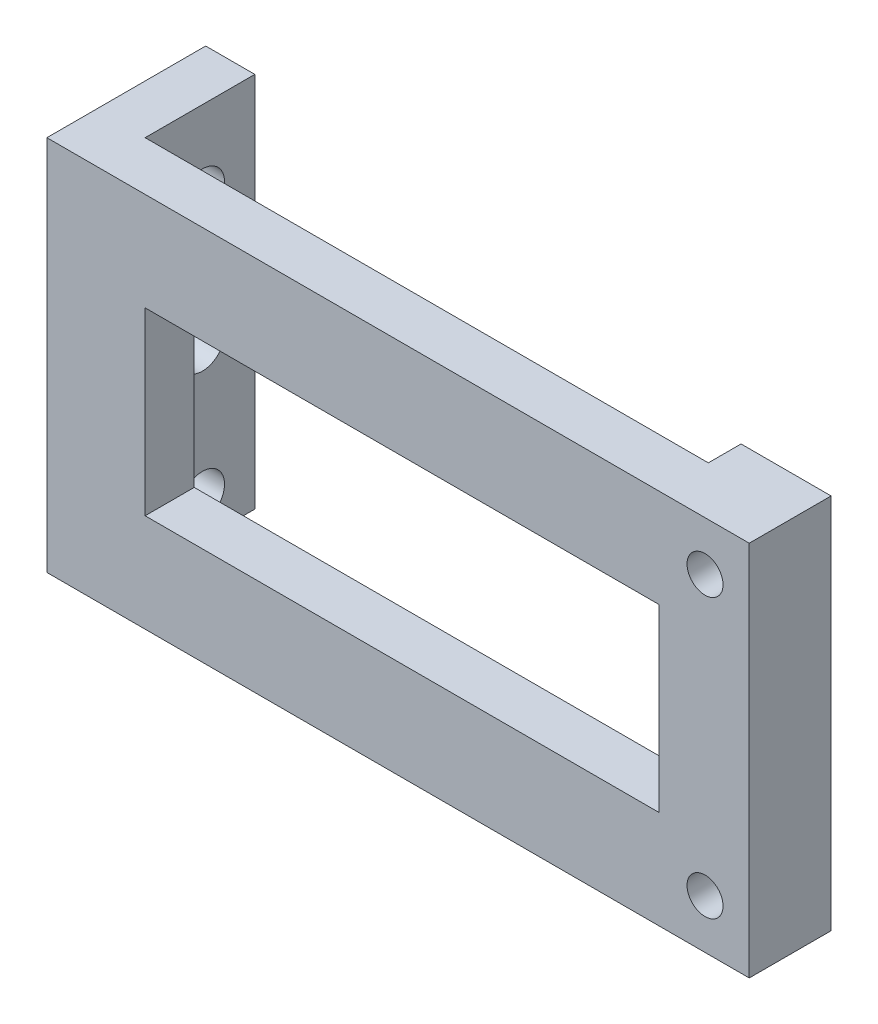
ISO-10303-21;
HEADER;
FILE_DESCRIPTION(('STEP AP214'),'2;1');
FILE_NAME('part.step','',(''),(''),'','','');
FILE_SCHEMA(('AUTOMOTIVE_DESIGN { 1 0 10303 214 1 1 1 1 }'));
ENDSEC;
DATA;
#1=APPLICATION_CONTEXT('core data for automotive mechanical design processes');
#2=APPLICATION_PROTOCOL_DEFINITION('international standard','automotive_design',2000,#1);
#3=PRODUCT_CONTEXT('',#1,'mechanical');
#4=PRODUCT('Part','Part','',(#3));
#5=PRODUCT_RELATED_PRODUCT_CATEGORY('part','',(#4));
#6=PRODUCT_DEFINITION_FORMATION('','',#4);
#7=PRODUCT_DEFINITION_CONTEXT('part definition',#1,'design');
#8=PRODUCT_DEFINITION('design','',#6,#7);
#9=PRODUCT_DEFINITION_SHAPE('','',#8);
#10=(LENGTH_UNIT() NAMED_UNIT(*) SI_UNIT(.MILLI.,.METRE.));
#11=(NAMED_UNIT(*) PLANE_ANGLE_UNIT() SI_UNIT($,.RADIAN.));
#12=(NAMED_UNIT(*) SI_UNIT($,.STERADIAN.) SOLID_ANGLE_UNIT());
#13=UNCERTAINTY_MEASURE_WITH_UNIT(LENGTH_MEASURE(1.E-05),#10,'distance_accuracy_value','');
#14=(GEOMETRIC_REPRESENTATION_CONTEXT(3) GLOBAL_UNCERTAINTY_ASSIGNED_CONTEXT((#13)) GLOBAL_UNIT_ASSIGNED_CONTEXT((#10,
#11,#12)) REPRESENTATION_CONTEXT('',''));
#15=CARTESIAN_POINT('',(0.,0.,0.));
#16=DIRECTION('',(0.,0.,1.));
#17=DIRECTION('',(1.,0.,0.));
#18=AXIS2_PLACEMENT_3D('',#15,#16,#17);
#19=CARTESIAN_POINT('',(-14.6316233815926,-9.25000000000001,-6.5));
#20=DIRECTION('',(-1.,0.,0.));
#21=DIRECTION('',(0.,-1.,0.));
#22=AXIS2_PLACEMENT_3D('',#19,#20,#21);
#23=CYLINDRICAL_SURFACE('',#22,1.35);
#24=CARTESIAN_POINT('',(-18.45,-9.25000000000001,-6.5));
#25=DIRECTION('',(-1.,0.,0.));
#26=DIRECTION('',(0.,-1.,0.));
#27=AXIS2_PLACEMENT_3D('',#24,#25,#26);
#28=CIRCLE('',#27,1.35);
#29=CARTESIAN_POINT('',(-18.45,-10.6,-6.5));
#30=VERTEX_POINT('',#29);
#31=EDGE_CURVE('E43',#30,#30,#28,.F.);
#32=ORIENTED_EDGE('',*,*,#31,.T.);
#33=EDGE_LOOP('',(#32));
#34=FACE_BOUND('',#33,.T.);
#35=CARTESIAN_POINT('',(-21.45,-9.25000000000001,-6.5));
#36=DIRECTION('',(-1.,0.,0.));
#37=DIRECTION('',(0.,-1.,0.));
#38=AXIS2_PLACEMENT_3D('',#35,#36,#37);
#39=CIRCLE('',#38,1.35);
#40=CARTESIAN_POINT('',(-21.45,-10.6,-6.5));
#41=VERTEX_POINT('',#40);
#42=EDGE_CURVE('E11',#41,#41,#39,.T.);
#43=ORIENTED_EDGE('',*,*,#42,.T.);
#44=EDGE_LOOP('',(#43));
#45=FACE_BOUND('',#44,.T.);
#46=ADVANCED_FACE('F35',(#34,#45),#23,.F.);
#47=CARTESIAN_POINT('',(0.,-5.5,-3.));
#48=DIRECTION('',(0.,-1.,0.));
#49=DIRECTION('',(0.,0.,-1.));
#50=AXIS2_PLACEMENT_3D('',#47,#48,#49);
#51=PLANE('',#50);
#52=DIRECTION('',(1.,0.,0.));
#53=VECTOR('',#52,1.);
#54=CARTESIAN_POINT('',(0.,-5.5,0.));
#55=LINE('',#54,#53);
#56=CARTESIAN_POINT('',(-15.45,-5.5,0.));
#57=VERTEX_POINT('',#56);
#58=CARTESIAN_POINT('',(15.95,-5.5,0.));
#59=VERTEX_POINT('',#58);
#60=EDGE_CURVE('E131',#57,#59,#55,.T.);
#61=ORIENTED_EDGE('',*,*,#60,.T.);
#62=DIRECTION('',(0.,0.,1.));
#63=VECTOR('',#62,1.);
#64=CARTESIAN_POINT('',(15.95,-5.5,-3.));
#65=LINE('',#64,#63);
#66=CARTESIAN_POINT('',(15.95,-5.5,-3.));
#67=VERTEX_POINT('',#66);
#68=EDGE_CURVE('E145',#67,#59,#65,.T.);
#69=ORIENTED_EDGE('',*,*,#68,.F.);
#70=DIRECTION('',(1.,0.,0.));
#71=VECTOR('',#70,1.);
#72=CARTESIAN_POINT('',(0.,-5.5,-3.));
#73=LINE('',#72,#71);
#74=CARTESIAN_POINT('',(-15.45,-5.5,-3.));
#75=VERTEX_POINT('',#74);
#76=EDGE_CURVE('E144',#75,#67,#73,.T.);
#77=ORIENTED_EDGE('',*,*,#76,.F.);
#78=DIRECTION('',(0.,0.,1.));
#79=VECTOR('',#78,1.);
#80=CARTESIAN_POINT('',(-15.45,-5.5,-3.));
#81=LINE('',#80,#79);
#82=EDGE_CURVE('E152',#75,#57,#81,.T.);
#83=ORIENTED_EDGE('',*,*,#82,.T.);
#84=EDGE_LOOP('',(#61,#69,#77,#83));
#85=FACE_BOUND('',#84,.T.);
#86=ADVANCED_FACE('F176',(#85),#51,.F.);
#87=CARTESIAN_POINT('',(0.,-11.5,-3.));
#88=DIRECTION('',(0.,1.,0.));
#89=DIRECTION('',(-1.,0.,0.));
#90=AXIS2_PLACEMENT_3D('',#87,#88,#89);
#91=PLANE('',#90);
#92=DIRECTION('',(-1.,0.,0.));
#93=VECTOR('',#92,1.);
#94=CARTESIAN_POINT('',(0.,-11.5,0.));
#95=LINE('',#94,#93);
#96=CARTESIAN_POINT('',(21.45,-11.5,0.));
#97=VERTEX_POINT('',#96);
#98=CARTESIAN_POINT('',(-21.45,-11.5,0.));
#99=VERTEX_POINT('',#98);
#100=EDGE_CURVE('E141',#97,#99,#95,.T.);
#101=ORIENTED_EDGE('',*,*,#100,.T.);
#102=DIRECTION('',(0.,0.,1.));
#103=VECTOR('',#102,1.);
#104=CARTESIAN_POINT('',(-21.45,-11.5,-9.7));
#105=LINE('',#104,#103);
#106=CARTESIAN_POINT('',(-21.45,-11.5,-9.7));
#107=VERTEX_POINT('',#106);
#108=EDGE_CURVE('E256',#107,#99,#105,.T.);
#109=ORIENTED_EDGE('',*,*,#108,.F.);
#110=DIRECTION('',(-1.,0.,0.));
#111=VECTOR('',#110,1.);
#112=CARTESIAN_POINT('',(0.,-11.5,-9.7));
#113=LINE('',#112,#111);
#114=CARTESIAN_POINT('',(-18.45,-11.5,-9.7));
#115=VERTEX_POINT('',#114);
#116=EDGE_CURVE('E117',#115,#107,#113,.T.);
#117=ORIENTED_EDGE('',*,*,#116,.F.);
#118=DIRECTION('',(0.,0.,1.));
#119=VECTOR('',#118,1.);
#120=CARTESIAN_POINT('',(-18.45,-11.5,-9.7));
#121=LINE('',#120,#119);
#122=CARTESIAN_POINT('',(-18.45,-11.5,-3.));
#123=VERTEX_POINT('',#122);
#124=EDGE_CURVE('E263',#115,#123,#121,.T.);
#125=ORIENTED_EDGE('',*,*,#124,.T.);
#126=DIRECTION('',(-1.,0.,0.));
#127=VECTOR('',#126,1.);
#128=CARTESIAN_POINT('',(0.,-11.5,-3.));
#129=LINE('',#128,#127);
#130=CARTESIAN_POINT('',(15.95,-11.5,-3.));
#131=VERTEX_POINT('',#130);
#132=EDGE_CURVE('E100',#131,#123,#129,.T.);
#133=ORIENTED_EDGE('',*,*,#132,.F.);
#134=DIRECTION('',(0.,0.,1.));
#135=VECTOR('',#134,1.);
#136=CARTESIAN_POINT('',(15.95,-11.5,-5.));
#137=LINE('',#136,#135);
#138=CARTESIAN_POINT('',(15.95,-11.5,-5.));
#139=VERTEX_POINT('',#138);
#140=EDGE_CURVE('E241',#139,#131,#137,.T.);
#141=ORIENTED_EDGE('',*,*,#140,.F.);
#142=DIRECTION('',(-1.,0.,0.));
#143=VECTOR('',#142,1.);
#144=CARTESIAN_POINT('',(0.,-11.5,-5.));
#145=LINE('',#144,#143);
#146=CARTESIAN_POINT('',(21.45,-11.5,-5.));
#147=VERTEX_POINT('',#146);
#148=EDGE_CURVE('E240',#147,#139,#145,.T.);
#149=ORIENTED_EDGE('',*,*,#148,.F.);
#150=DIRECTION('',(0.,0.,1.));
#151=VECTOR('',#150,1.);
#152=CARTESIAN_POINT('',(21.45,-11.5,-5.));
#153=LINE('',#152,#151);
#154=EDGE_CURVE('E227',#147,#97,#153,.T.);
#155=ORIENTED_EDGE('',*,*,#154,.T.);
#156=EDGE_LOOP('',(#101,#109,#117,#125,#133,#141,#149,#155));
#157=FACE_BOUND('',#156,.T.);
#158=ADVANCED_FACE('F180',(#157),#91,.F.);
#159=CARTESIAN_POINT('',(0.,11.5,-3.));
#160=DIRECTION('',(0.,1.,0.));
#161=DIRECTION('',(-1.,0.,0.));
#162=AXIS2_PLACEMENT_3D('',#159,#160,#161);
#163=PLANE('',#162);
#164=DIRECTION('',(-1.,0.,0.));
#165=VECTOR('',#164,1.);
#166=CARTESIAN_POINT('',(0.,11.5,0.));
#167=LINE('',#166,#165);
#168=CARTESIAN_POINT('',(21.45,11.5,0.));
#169=VERTEX_POINT('',#168);
#170=CARTESIAN_POINT('',(-21.45,11.5,0.));
#171=VERTEX_POINT('',#170);
#172=EDGE_CURVE('E138',#169,#171,#167,.T.);
#173=ORIENTED_EDGE('',*,*,#172,.F.);
#174=DIRECTION('',(0.,0.,1.));
#175=VECTOR('',#174,1.);
#176=CARTESIAN_POINT('',(21.45,11.5,-5.));
#177=LINE('',#176,#175);
#178=CARTESIAN_POINT('',(21.45,11.5,-5.));
#179=VERTEX_POINT('',#178);
#180=EDGE_CURVE('E134',#179,#169,#177,.T.);
#181=ORIENTED_EDGE('',*,*,#180,.F.);
#182=DIRECTION('',(-1.,0.,0.));
#183=VECTOR('',#182,1.);
#184=CARTESIAN_POINT('',(0.,11.5,-5.));
#185=LINE('',#184,#183);
#186=CARTESIAN_POINT('',(15.95,11.5,-5.));
#187=VERTEX_POINT('',#186);
#188=EDGE_CURVE('E274',#179,#187,#185,.T.);
#189=ORIENTED_EDGE('',*,*,#188,.T.);
#190=DIRECTION('',(0.,0.,1.));
#191=VECTOR('',#190,1.);
#192=CARTESIAN_POINT('',(15.95,11.5,-5.));
#193=LINE('',#192,#191);
#194=CARTESIAN_POINT('',(15.95,11.5,-3.));
#195=VERTEX_POINT('',#194);
#196=EDGE_CURVE('E123',#187,#195,#193,.T.);
#197=ORIENTED_EDGE('',*,*,#196,.T.);
#198=DIRECTION('',(-1.,0.,0.));
#199=VECTOR('',#198,1.);
#200=CARTESIAN_POINT('',(0.,11.5,-3.));
#201=LINE('',#200,#199);
#202=CARTESIAN_POINT('',(-18.45,11.5,-3.));
#203=VERTEX_POINT('',#202);
#204=EDGE_CURVE('E96',#195,#203,#201,.T.);
#205=ORIENTED_EDGE('',*,*,#204,.T.);
#206=DIRECTION('',(0.,0.,1.));
#207=VECTOR('',#206,1.);
#208=CARTESIAN_POINT('',(-18.45,11.5,-9.7));
#209=LINE('',#208,#207);
#210=CARTESIAN_POINT('',(-18.45,11.5,-9.7));
#211=VERTEX_POINT('',#210);
#212=EDGE_CURVE('E107',#211,#203,#209,.T.);
#213=ORIENTED_EDGE('',*,*,#212,.F.);
#214=DIRECTION('',(-1.,0.,0.));
#215=VECTOR('',#214,1.);
#216=CARTESIAN_POINT('',(0.,11.5,-9.7));
#217=LINE('',#216,#215);
#218=CARTESIAN_POINT('',(-21.45,11.5,-9.7));
#219=VERTEX_POINT('',#218);
#220=EDGE_CURVE('E317',#211,#219,#217,.T.);
#221=ORIENTED_EDGE('',*,*,#220,.T.);
#222=DIRECTION('',(0.,0.,1.));
#223=VECTOR('',#222,1.);
#224=CARTESIAN_POINT('',(-21.45,11.5,-9.7));
#225=LINE('',#224,#223);
#226=EDGE_CURVE('E116',#219,#171,#225,.T.);
#227=ORIENTED_EDGE('',*,*,#226,.T.);
#228=EDGE_LOOP('',(#173,#181,#189,#197,#205,#213,#221,#227));
#229=FACE_BOUND('',#228,.T.);
#230=ADVANCED_FACE('F120',(#229),#163,.T.);
#231=CARTESIAN_POINT('',(0.,5.5,-3.));
#232=DIRECTION('',(0.,-1.,0.));
#233=DIRECTION('',(1.,0.,0.));
#234=AXIS2_PLACEMENT_3D('',#231,#232,#233);
#235=PLANE('',#234);
#236=DIRECTION('',(1.,0.,0.));
#237=VECTOR('',#236,1.);
#238=CARTESIAN_POINT('',(0.,5.5,0.));
#239=LINE('',#238,#237);
#240=CARTESIAN_POINT('',(-15.45,5.5,0.));
#241=VERTEX_POINT('',#240);
#242=CARTESIAN_POINT('',(15.95,5.5,0.));
#243=VERTEX_POINT('',#242);
#244=EDGE_CURVE('E136',#241,#243,#239,.T.);
#245=ORIENTED_EDGE('',*,*,#244,.F.);
#246=DIRECTION('',(0.,0.,1.));
#247=VECTOR('',#246,1.);
#248=CARTESIAN_POINT('',(-15.45,5.5,-3.));
#249=LINE('',#248,#247);
#250=CARTESIAN_POINT('',(-15.45,5.5,-3.));
#251=VERTEX_POINT('',#250);
#252=EDGE_CURVE('E150',#251,#241,#249,.T.);
#253=ORIENTED_EDGE('',*,*,#252,.F.);
#254=DIRECTION('',(1.,0.,0.));
#255=VECTOR('',#254,1.);
#256=CARTESIAN_POINT('',(0.,5.5,-3.));
#257=LINE('',#256,#255);
#258=CARTESIAN_POINT('',(15.95,5.5,-3.));
#259=VERTEX_POINT('',#258);
#260=EDGE_CURVE('E126',#251,#259,#257,.T.);
#261=ORIENTED_EDGE('',*,*,#260,.T.);
#262=DIRECTION('',(0.,0.,1.));
#263=VECTOR('',#262,1.);
#264=CARTESIAN_POINT('',(15.95,5.5,-3.));
#265=LINE('',#264,#263);
#266=EDGE_CURVE('E147',#259,#243,#265,.T.);
#267=ORIENTED_EDGE('',*,*,#266,.T.);
#268=EDGE_LOOP('',(#245,#253,#261,#267));
#269=FACE_BOUND('',#268,.T.);
#270=ADVANCED_FACE('F191',(#269),#235,.T.);
#271=CARTESIAN_POINT('',(-15.45,0.,-3.));
#272=DIRECTION('',(-1.,0.,0.));
#273=DIRECTION('',(0.,0.,1.));
#274=AXIS2_PLACEMENT_3D('',#271,#272,#273);
#275=PLANE('',#274);
#276=DIRECTION('',(0.,-1.,0.));
#277=VECTOR('',#276,1.);
#278=CARTESIAN_POINT('',(-15.45,0.,0.));
#279=LINE('',#278,#277);
#280=EDGE_CURVE('E65',#241,#57,#279,.T.);
#281=ORIENTED_EDGE('',*,*,#280,.T.);
#282=ORIENTED_EDGE('',*,*,#82,.F.);
#283=DIRECTION('',(0.,-1.,0.));
#284=VECTOR('',#283,1.);
#285=CARTESIAN_POINT('',(-15.45,0.,-3.));
#286=LINE('',#285,#284);
#287=EDGE_CURVE('E77',#251,#75,#286,.T.);
#288=ORIENTED_EDGE('',*,*,#287,.F.);
#289=ORIENTED_EDGE('',*,*,#252,.T.);
#290=EDGE_LOOP('',(#281,#282,#288,#289));
#291=FACE_BOUND('',#290,.T.);
#292=ADVANCED_FACE('F188',(#291),#275,.F.);
#293=CARTESIAN_POINT('',(0.,0.,-3.));
#294=DIRECTION('',(0.,0.,1.));
#295=DIRECTION('',(1.,0.,0.));
#296=AXIS2_PLACEMENT_3D('',#293,#294,#295);
#297=PLANE('',#296);
#298=ORIENTED_EDGE('',*,*,#76,.T.);
#299=DIRECTION('',(0.,-1.,0.));
#300=VECTOR('',#299,1.);
#301=CARTESIAN_POINT('',(15.95,0.,-3.));
#302=LINE('',#301,#300);
#303=EDGE_CURVE('E51',#67,#131,#302,.T.);
#304=ORIENTED_EDGE('',*,*,#303,.T.);
#305=ORIENTED_EDGE('',*,*,#132,.T.);
#306=DIRECTION('',(0.,-1.,0.));
#307=VECTOR('',#306,1.);
#308=CARTESIAN_POINT('',(-18.45,0.,-3.));
#309=LINE('',#308,#307);
#310=EDGE_CURVE('E92',#203,#123,#309,.T.);
#311=ORIENTED_EDGE('',*,*,#310,.F.);
#312=ORIENTED_EDGE('',*,*,#204,.F.);
#313=EDGE_CURVE('E124',#195,#259,#302,.T.);
#314=ORIENTED_EDGE('',*,*,#313,.T.);
#315=ORIENTED_EDGE('',*,*,#260,.F.);
#316=ORIENTED_EDGE('',*,*,#287,.T.);
#317=EDGE_LOOP('',(#298,#304,#305,#311,#312,#314,#315,#316));
#318=FACE_BOUND('',#317,.T.);
#319=ADVANCED_FACE('F94',(#318),#297,.F.);
#320=CARTESIAN_POINT('',(0.,0.,0.));
#321=DIRECTION('',(0.,0.,1.));
#322=DIRECTION('',(1.,0.,0.));
#323=AXIS2_PLACEMENT_3D('',#320,#321,#322);
#324=PLANE('',#323);
#325=ORIENTED_EDGE('',*,*,#244,.T.);
#326=DIRECTION('',(0.,-1.,0.));
#327=VECTOR('',#326,1.);
#328=CARTESIAN_POINT('',(15.95,0.,0.));
#329=LINE('',#328,#327);
#330=EDGE_CURVE('E70',#243,#59,#329,.T.);
#331=ORIENTED_EDGE('',*,*,#330,.T.);
#332=ORIENTED_EDGE('',*,*,#60,.F.);
#333=ORIENTED_EDGE('',*,*,#280,.F.);
#334=EDGE_LOOP('',(#325,#331,#332,#333));
#335=FACE_BOUND('',#334,.T.);
#336=DIRECTION('',(0.,-1.,0.));
#337=VECTOR('',#336,1.);
#338=CARTESIAN_POINT('',(21.45,0.,0.));
#339=LINE('',#338,#337);
#340=EDGE_CURVE('E223',#169,#97,#339,.T.);
#341=ORIENTED_EDGE('',*,*,#340,.F.);
#342=ORIENTED_EDGE('',*,*,#172,.T.);
#343=DIRECTION('',(0.,-1.,0.));
#344=VECTOR('',#343,1.);
#345=CARTESIAN_POINT('',(-21.45,0.,0.));
#346=LINE('',#345,#344);
#347=EDGE_CURVE('E246',#171,#99,#346,.T.);
#348=ORIENTED_EDGE('',*,*,#347,.T.);
#349=ORIENTED_EDGE('',*,*,#100,.F.);
#350=EDGE_LOOP('',(#341,#342,#348,#349));
#351=FACE_BOUND('',#350,.T.);
#352=CARTESIAN_POINT('',(18.75,8.5,0.));
#353=DIRECTION('',(0.,0.,1.));
#354=DIRECTION('',(1.,0.,0.));
#355=AXIS2_PLACEMENT_3D('',#352,#353,#354);
#356=CIRCLE('',#355,1.1);
#357=CARTESIAN_POINT('',(19.85,8.5,0.));
#358=VERTEX_POINT('',#357);
#359=EDGE_CURVE('E265',#358,#358,#356,.T.);
#360=ORIENTED_EDGE('',*,*,#359,.F.);
#361=EDGE_LOOP('',(#360));
#362=FACE_BOUND('',#361,.T.);
#363=CARTESIAN_POINT('',(18.75,-8.5,0.));
#364=DIRECTION('',(0.,0.,1.));
#365=DIRECTION('',(1.,0.,0.));
#366=AXIS2_PLACEMENT_3D('',#363,#364,#365);
#367=CIRCLE('',#366,1.1);
#368=CARTESIAN_POINT('',(19.85,-8.5,0.));
#369=VERTEX_POINT('',#368);
#370=EDGE_CURVE('E285',#369,#369,#367,.T.);
#371=ORIENTED_EDGE('',*,*,#370,.F.);
#372=EDGE_LOOP('',(#371));
#373=FACE_BOUND('',#372,.T.);
#374=ADVANCED_FACE('F198',(#335,#351,#362,#373),#324,.T.);
#375=CARTESIAN_POINT('',(15.95,0.,-5.));
#376=DIRECTION('',(-1.,0.,0.));
#377=DIRECTION('',(0.,-1.,0.));
#378=AXIS2_PLACEMENT_3D('',#375,#376,#377);
#379=PLANE('',#378);
#380=ORIENTED_EDGE('',*,*,#330,.F.);
#381=ORIENTED_EDGE('',*,*,#266,.F.);
#382=ORIENTED_EDGE('',*,*,#313,.F.);
#383=ORIENTED_EDGE('',*,*,#196,.F.);
#384=DIRECTION('',(0.,-1.,0.));
#385=VECTOR('',#384,1.);
#386=CARTESIAN_POINT('',(15.95,0.,-5.));
#387=LINE('',#386,#385);
#388=EDGE_CURVE('E276',#187,#139,#387,.T.);
#389=ORIENTED_EDGE('',*,*,#388,.T.);
#390=ORIENTED_EDGE('',*,*,#140,.T.);
#391=ORIENTED_EDGE('',*,*,#303,.F.);
#392=ORIENTED_EDGE('',*,*,#68,.T.);
#393=EDGE_LOOP('',(#380,#381,#382,#383,#389,#390,#391,#392));
#394=FACE_BOUND('',#393,.T.);
#395=ADVANCED_FACE('F201',(#394),#379,.T.);
#396=CARTESIAN_POINT('',(21.45,0.,-5.));
#397=DIRECTION('',(-1.,0.,0.));
#398=DIRECTION('',(0.,-1.,0.));
#399=AXIS2_PLACEMENT_3D('',#396,#397,#398);
#400=PLANE('',#399);
#401=ORIENTED_EDGE('',*,*,#340,.T.);
#402=ORIENTED_EDGE('',*,*,#154,.F.);
#403=DIRECTION('',(0.,-1.,0.));
#404=VECTOR('',#403,1.);
#405=CARTESIAN_POINT('',(21.45,0.,-5.));
#406=LINE('',#405,#404);
#407=EDGE_CURVE('E280',#179,#147,#406,.T.);
#408=ORIENTED_EDGE('',*,*,#407,.F.);
#409=ORIENTED_EDGE('',*,*,#180,.T.);
#410=EDGE_LOOP('',(#401,#402,#408,#409));
#411=FACE_BOUND('',#410,.T.);
#412=ADVANCED_FACE('F210',(#411),#400,.F.);
#413=CARTESIAN_POINT('',(18.75,-8.5,-5.));
#414=DIRECTION('',(0.,0.,1.));
#415=DIRECTION('',(1.,0.,0.));
#416=AXIS2_PLACEMENT_3D('',#413,#414,#415);
#417=CYLINDRICAL_SURFACE('',#416,1.1);
#418=CARTESIAN_POINT('',(18.75,-8.5,-5.));
#419=DIRECTION('',(0.,0.,1.));
#420=DIRECTION('',(1.,0.,0.));
#421=AXIS2_PLACEMENT_3D('',#418,#419,#420);
#422=CIRCLE('',#421,1.1);
#423=CARTESIAN_POINT('',(19.85,-8.5,-5.));
#424=VERTEX_POINT('',#423);
#425=EDGE_CURVE('E271',#424,#424,#422,.T.);
#426=ORIENTED_EDGE('',*,*,#425,.F.);
#427=EDGE_LOOP('',(#426));
#428=FACE_BOUND('',#427,.T.);
#429=ORIENTED_EDGE('',*,*,#370,.T.);
#430=EDGE_LOOP('',(#429));
#431=FACE_BOUND('',#430,.T.);
#432=ADVANCED_FACE('F206',(#428,#431),#417,.F.);
#433=CARTESIAN_POINT('',(18.75,8.5,-5.));
#434=DIRECTION('',(0.,0.,1.));
#435=DIRECTION('',(1.,0.,0.));
#436=AXIS2_PLACEMENT_3D('',#433,#434,#435);
#437=CYLINDRICAL_SURFACE('',#436,1.1);
#438=CARTESIAN_POINT('',(18.75,8.5,-5.));
#439=DIRECTION('',(0.,0.,1.));
#440=DIRECTION('',(1.,0.,0.));
#441=AXIS2_PLACEMENT_3D('',#438,#439,#440);
#442=CIRCLE('',#441,1.1);
#443=CARTESIAN_POINT('',(19.85,8.5,-5.));
#444=VERTEX_POINT('',#443);
#445=EDGE_CURVE('E234',#444,#444,#442,.T.);
#446=ORIENTED_EDGE('',*,*,#445,.F.);
#447=EDGE_LOOP('',(#446));
#448=FACE_BOUND('',#447,.T.);
#449=ORIENTED_EDGE('',*,*,#359,.T.);
#450=EDGE_LOOP('',(#449));
#451=FACE_BOUND('',#450,.T.);
#452=ADVANCED_FACE('F170',(#448,#451),#437,.F.);
#453=CARTESIAN_POINT('',(0.,0.,-5.));
#454=DIRECTION('',(0.,0.,1.));
#455=DIRECTION('',(1.,0.,0.));
#456=AXIS2_PLACEMENT_3D('',#453,#454,#455);
#457=PLANE('',#456);
#458=ORIENTED_EDGE('',*,*,#445,.T.);
#459=EDGE_LOOP('',(#458));
#460=FACE_BOUND('',#459,.T.);
#461=ORIENTED_EDGE('',*,*,#425,.T.);
#462=EDGE_LOOP('',(#461));
#463=FACE_BOUND('',#462,.T.);
#464=ORIENTED_EDGE('',*,*,#188,.F.);
#465=ORIENTED_EDGE('',*,*,#407,.T.);
#466=ORIENTED_EDGE('',*,*,#148,.T.);
#467=ORIENTED_EDGE('',*,*,#388,.F.);
#468=EDGE_LOOP('',(#464,#465,#466,#467));
#469=FACE_BOUND('',#468,.T.);
#470=ADVANCED_FACE('F160',(#460,#463,#469),#457,.F.);
#471=CARTESIAN_POINT('',(-18.45,0.,-9.7));
#472=DIRECTION('',(-1.,0.,0.));
#473=DIRECTION('',(0.,-1.,0.));
#474=AXIS2_PLACEMENT_3D('',#471,#472,#473);
#475=PLANE('',#474);
#476=CARTESIAN_POINT('',(-18.45,-1.25,-6.5));
#477=DIRECTION('',(-1.,0.,0.));
#478=DIRECTION('',(0.,-1.,0.));
#479=AXIS2_PLACEMENT_3D('',#476,#477,#478);
#480=CIRCLE('',#479,1.35);
#481=CARTESIAN_POINT('',(-18.45,-2.6,-6.5));
#482=VERTEX_POINT('',#481);
#483=EDGE_CURVE('E331',#482,#482,#480,.F.);
#484=ORIENTED_EDGE('',*,*,#483,.F.);
#485=EDGE_LOOP('',(#484));
#486=FACE_BOUND('',#485,.T.);
#487=CARTESIAN_POINT('',(-18.45,6.75,-6.5));
#488=DIRECTION('',(-1.,0.,0.));
#489=DIRECTION('',(0.,-1.,0.));
#490=AXIS2_PLACEMENT_3D('',#487,#488,#489);
#491=CIRCLE('',#490,1.35);
#492=CARTESIAN_POINT('',(-18.45,5.4,-6.5));
#493=VERTEX_POINT('',#492);
#494=EDGE_CURVE('E253',#493,#493,#491,.F.);
#495=ORIENTED_EDGE('',*,*,#494,.F.);
#496=EDGE_LOOP('',(#495));
#497=FACE_BOUND('',#496,.T.);
#498=ORIENTED_EDGE('',*,*,#212,.T.);
#499=ORIENTED_EDGE('',*,*,#310,.T.);
#500=ORIENTED_EDGE('',*,*,#124,.F.);
#501=DIRECTION('',(0.,-1.,0.));
#502=VECTOR('',#501,1.);
#503=CARTESIAN_POINT('',(-18.45,0.,-9.7));
#504=LINE('',#503,#502);
#505=EDGE_CURVE('E112',#211,#115,#504,.T.);
#506=ORIENTED_EDGE('',*,*,#505,.F.);
#507=EDGE_LOOP('',(#498,#499,#500,#506));
#508=FACE_BOUND('',#507,.T.);
#509=ORIENTED_EDGE('',*,*,#31,.F.);
#510=EDGE_LOOP('',(#509));
#511=FACE_BOUND('',#510,.T.);
#512=ADVANCED_FACE('F108',(#486,#497,#508,#511),#475,.F.);
#513=CARTESIAN_POINT('',(-21.45,0.,-9.7));
#514=DIRECTION('',(-1.,0.,0.));
#515=DIRECTION('',(0.,-1.,0.));
#516=AXIS2_PLACEMENT_3D('',#513,#514,#515);
#517=PLANE('',#516);
#518=CARTESIAN_POINT('',(-21.45,-1.25,-6.5));
#519=DIRECTION('',(-1.,0.,0.));
#520=DIRECTION('',(0.,-1.,0.));
#521=AXIS2_PLACEMENT_3D('',#518,#519,#520);
#522=CIRCLE('',#521,1.35);
#523=CARTESIAN_POINT('',(-21.45,-2.6,-6.5));
#524=VERTEX_POINT('',#523);
#525=EDGE_CURVE('E328',#524,#524,#522,.T.);
#526=ORIENTED_EDGE('',*,*,#525,.F.);
#527=EDGE_LOOP('',(#526));
#528=FACE_BOUND('',#527,.T.);
#529=CARTESIAN_POINT('',(-21.45,6.75,-6.5));
#530=DIRECTION('',(-1.,0.,0.));
#531=DIRECTION('',(0.,-1.,0.));
#532=AXIS2_PLACEMENT_3D('',#529,#530,#531);
#533=CIRCLE('',#532,1.35);
#534=CARTESIAN_POINT('',(-21.45,5.4,-6.5));
#535=VERTEX_POINT('',#534);
#536=EDGE_CURVE('E325',#535,#535,#533,.T.);
#537=ORIENTED_EDGE('',*,*,#536,.F.);
#538=EDGE_LOOP('',(#537));
#539=FACE_BOUND('',#538,.T.);
#540=ORIENTED_EDGE('',*,*,#347,.F.);
#541=ORIENTED_EDGE('',*,*,#226,.F.);
#542=DIRECTION('',(0.,-1.,0.));
#543=VECTOR('',#542,1.);
#544=CARTESIAN_POINT('',(-21.45,0.,-9.7));
#545=LINE('',#544,#543);
#546=EDGE_CURVE('E260',#219,#107,#545,.T.);
#547=ORIENTED_EDGE('',*,*,#546,.T.);
#548=ORIENTED_EDGE('',*,*,#108,.T.);
#549=EDGE_LOOP('',(#540,#541,#547,#548));
#550=FACE_BOUND('',#549,.T.);
#551=ORIENTED_EDGE('',*,*,#42,.F.);
#552=EDGE_LOOP('',(#551));
#553=FACE_BOUND('',#552,.T.);
#554=ADVANCED_FACE('F159',(#528,#539,#550,#553),#517,.T.);
#555=CARTESIAN_POINT('',(0.,0.,-9.7));
#556=DIRECTION('',(0.,0.,1.));
#557=DIRECTION('',(1.,0.,0.));
#558=AXIS2_PLACEMENT_3D('',#555,#556,#557);
#559=PLANE('',#558);
#560=ORIENTED_EDGE('',*,*,#505,.T.);
#561=ORIENTED_EDGE('',*,*,#116,.T.);
#562=ORIENTED_EDGE('',*,*,#546,.F.);
#563=ORIENTED_EDGE('',*,*,#220,.F.);
#564=EDGE_LOOP('',(#560,#561,#562,#563));
#565=FACE_BOUND('',#564,.T.);
#566=ADVANCED_FACE('F167',(#565),#559,.F.);
#567=CARTESIAN_POINT('',(-14.6316233815926,6.75,-6.5));
#568=DIRECTION('',(-1.,0.,0.));
#569=DIRECTION('',(0.,-1.,0.));
#570=AXIS2_PLACEMENT_3D('',#567,#568,#569);
#571=CYLINDRICAL_SURFACE('',#570,1.35);
#572=ORIENTED_EDGE('',*,*,#494,.T.);
#573=EDGE_LOOP('',(#572));
#574=FACE_BOUND('',#573,.T.);
#575=ORIENTED_EDGE('',*,*,#536,.T.);
#576=EDGE_LOOP('',(#575));
#577=FACE_BOUND('',#576,.T.);
#578=ADVANCED_FACE('F337',(#574,#577),#571,.F.);
#579=CARTESIAN_POINT('',(-14.6316233815926,-1.25,-6.5));
#580=DIRECTION('',(-1.,0.,0.));
#581=DIRECTION('',(0.,-1.,0.));
#582=AXIS2_PLACEMENT_3D('',#579,#580,#581);
#583=CYLINDRICAL_SURFACE('',#582,1.35);
#584=ORIENTED_EDGE('',*,*,#483,.T.);
#585=EDGE_LOOP('',(#584));
#586=FACE_BOUND('',#585,.T.);
#587=ORIENTED_EDGE('',*,*,#525,.T.);
#588=EDGE_LOOP('',(#587));
#589=FACE_BOUND('',#588,.T.);
#590=ADVANCED_FACE('F334',(#586,#589),#583,.F.);
#591=CLOSED_SHELL('',(#46,#86,#158,#230,#270,#292,#319,#374,#395,#412,#432,#452,#470,#512,#554,
#566,#578,#590));
#592=MANIFOLD_SOLID_BREP('B2',#591);
#593=ADVANCED_BREP_SHAPE_REPRESENTATION('',(#18,#592),#14);
#594=SHAPE_DEFINITION_REPRESENTATION(#9,#593);
ENDSEC;
END-ISO-10303-21;
